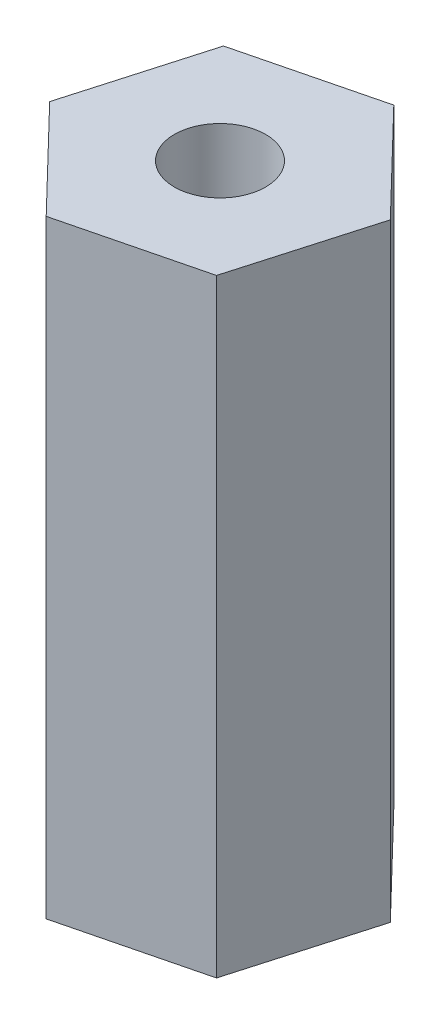
ISO-10303-21;
HEADER;
FILE_DESCRIPTION(('STEP AP214'),'2;1');
FILE_NAME('part.step','',(''),(''),'','','');
FILE_SCHEMA(('AUTOMOTIVE_DESIGN { 1 0 10303 214 1 1 1 1 }'));
ENDSEC;
DATA;
#1=APPLICATION_CONTEXT('core data for automotive mechanical design processes');
#2=APPLICATION_PROTOCOL_DEFINITION('international standard','automotive_design',2000,#1);
#3=PRODUCT_CONTEXT('',#1,'mechanical');
#4=PRODUCT('Part','Part','',(#3));
#5=PRODUCT_RELATED_PRODUCT_CATEGORY('part','',(#4));
#6=PRODUCT_DEFINITION_FORMATION('','',#4);
#7=PRODUCT_DEFINITION_CONTEXT('part definition',#1,'design');
#8=PRODUCT_DEFINITION('design','',#6,#7);
#9=PRODUCT_DEFINITION_SHAPE('','',#8);
#10=(LENGTH_UNIT() NAMED_UNIT(*) SI_UNIT(.MILLI.,.METRE.));
#11=(NAMED_UNIT(*) PLANE_ANGLE_UNIT() SI_UNIT($,.RADIAN.));
#12=(NAMED_UNIT(*) SI_UNIT($,.STERADIAN.) SOLID_ANGLE_UNIT());
#13=UNCERTAINTY_MEASURE_WITH_UNIT(LENGTH_MEASURE(1.E-05),#10,'distance_accuracy_value','');
#14=(GEOMETRIC_REPRESENTATION_CONTEXT(3) GLOBAL_UNCERTAINTY_ASSIGNED_CONTEXT((#13)) GLOBAL_UNIT_ASSIGNED_CONTEXT((#10,
#11,#12)) REPRESENTATION_CONTEXT('',''));
#15=CARTESIAN_POINT('',(0.,0.,0.));
#16=DIRECTION('',(0.,0.,1.));
#17=DIRECTION('',(1.,0.,0.));
#18=AXIS2_PLACEMENT_3D('',#15,#16,#17);
#19=CARTESIAN_POINT('',(-1.27350852462126,20.,4.43976456256977));
#20=DIRECTION('',(-0.241835763884429,0.,-0.970317197264088));
#21=DIRECTION('',(-0.970317197264088,0.,0.241835763884429));
#22=AXIS2_PLACEMENT_3D('',#19,#20,#21);
#23=PLANE('',#22);
#24=DIRECTION('',(0.970317197264088,0.,-0.241835763884429));
#25=VECTOR('',#24,1.);
#26=CARTESIAN_POINT('',(-1.27350852462126,0.,4.43976456256977));
#27=LINE('',#26,#25);
#28=CARTESIAN_POINT('',(-1.27350852462126,0.,4.43976456256977));
#29=VERTEX_POINT('',#28);
#30=CARTESIAN_POINT('',(3.20819463569669,0.,3.32277301554294));
#31=VERTEX_POINT('',#30);
#32=EDGE_CURVE('E117',#29,#31,#27,.T.);
#33=ORIENTED_EDGE('',*,*,#32,.T.);
#34=DIRECTION('',(0.,-1.,0.));
#35=VECTOR('',#34,1.);
#36=CARTESIAN_POINT('',(3.20819463569669,20.,3.32277301554294));
#37=LINE('',#36,#35);
#38=CARTESIAN_POINT('',(3.20819463569669,20.,3.32277301554294));
#39=VERTEX_POINT('',#38);
#40=EDGE_CURVE('E11',#39,#31,#37,.T.);
#41=ORIENTED_EDGE('',*,*,#40,.F.);
#42=DIRECTION('',(0.970317197264088,0.,-0.241835763884429));
#43=VECTOR('',#42,1.);
#44=CARTESIAN_POINT('',(-1.27350852462126,20.,4.43976456256977));
#45=LINE('',#44,#43);
#46=CARTESIAN_POINT('',(-1.27350852462126,20.,4.43976456256977));
#47=VERTEX_POINT('',#46);
#48=EDGE_CURVE('E128',#47,#39,#45,.T.);
#49=ORIENTED_EDGE('',*,*,#48,.F.);
#50=DIRECTION('',(0.,-1.,0.));
#51=VECTOR('',#50,1.);
#52=CARTESIAN_POINT('',(-1.27350852462126,20.,4.43976456256977));
#53=LINE('',#52,#51);
#54=EDGE_CURVE('E113',#47,#29,#53,.T.);
#55=ORIENTED_EDGE('',*,*,#54,.T.);
#56=EDGE_LOOP('',(#33,#41,#49,#55));
#57=FACE_BOUND('',#56,.T.);
#58=ADVANCED_FACE('F33',(#57),#23,.F.);
#59=CARTESIAN_POINT('',(3.20819463569669,20.,3.32277301554294));
#60=DIRECTION('',(-0.961237224501831,0.,-0.275722683564513));
#61=DIRECTION('',(-0.275722683564513,0.,0.961237224501831));
#62=AXIS2_PLACEMENT_3D('',#59,#60,#61);
#63=PLANE('',#62);
#64=DIRECTION('',(0.275722683564513,0.,-0.961237224501831));
#65=VECTOR('',#64,1.);
#66=CARTESIAN_POINT('',(3.20819463569669,0.,3.32277301554294));
#67=LINE('',#66,#65);
#68=CARTESIAN_POINT('',(4.48170316031795,0.,-1.11699154702683));
#69=VERTEX_POINT('',#68);
#70=EDGE_CURVE('E120',#31,#69,#67,.T.);
#71=ORIENTED_EDGE('',*,*,#70,.T.);
#72=DIRECTION('',(0.,-1.,0.));
#73=VECTOR('',#72,1.);
#74=CARTESIAN_POINT('',(4.48170316031795,20.,-1.11699154702683));
#75=LINE('',#74,#73);
#76=CARTESIAN_POINT('',(4.48170316031795,20.,-1.11699154702683));
#77=VERTEX_POINT('',#76);
#78=EDGE_CURVE('E41',#77,#69,#75,.T.);
#79=ORIENTED_EDGE('',*,*,#78,.F.);
#80=DIRECTION('',(0.275722683564513,0.,-0.961237224501831));
#81=VECTOR('',#80,1.);
#82=CARTESIAN_POINT('',(3.20819463569669,20.,3.32277301554294));
#83=LINE('',#82,#81);
#84=EDGE_CURVE('E86',#39,#77,#83,.T.);
#85=ORIENTED_EDGE('',*,*,#84,.F.);
#86=ORIENTED_EDGE('',*,*,#40,.T.);
#87=EDGE_LOOP('',(#71,#79,#85,#86));
#88=FACE_BOUND('',#87,.T.);
#89=ADVANCED_FACE('F153',(#88),#63,.F.);
#90=CARTESIAN_POINT('',(4.48170316031795,20.,-1.11699154702683));
#91=DIRECTION('',(-0.719401460617402,0.,0.694594513699574));
#92=DIRECTION('',(0.694594513699574,0.,0.719401460617402));
#93=AXIS2_PLACEMENT_3D('',#90,#91,#92);
#94=PLANE('',#93);
#95=DIRECTION('',(-0.694594513699574,0.,-0.719401460617402));
#96=VECTOR('',#95,1.);
#97=CARTESIAN_POINT('',(4.48170316031795,0.,-1.11699154702683));
#98=LINE('',#97,#96);
#99=CARTESIAN_POINT('',(1.27350852462126,0.,-4.43976456256977));
#100=VERTEX_POINT('',#99);
#101=EDGE_CURVE('E123',#69,#100,#98,.T.);
#102=ORIENTED_EDGE('',*,*,#101,.T.);
#103=DIRECTION('',(0.,-1.,0.));
#104=VECTOR('',#103,1.);
#105=CARTESIAN_POINT('',(1.27350852462126,20.,-4.43976456256977));
#106=LINE('',#105,#104);
#107=CARTESIAN_POINT('',(1.27350852462126,20.,-4.43976456256977));
#108=VERTEX_POINT('',#107);
#109=EDGE_CURVE('E108',#108,#100,#106,.T.);
#110=ORIENTED_EDGE('',*,*,#109,.F.);
#111=DIRECTION('',(-0.694594513699574,0.,-0.719401460617402));
#112=VECTOR('',#111,1.);
#113=CARTESIAN_POINT('',(4.48170316031795,20.,-1.11699154702683));
#114=LINE('',#113,#112);
#115=EDGE_CURVE('E99',#77,#108,#114,.T.);
#116=ORIENTED_EDGE('',*,*,#115,.F.);
#117=ORIENTED_EDGE('',*,*,#78,.T.);
#118=EDGE_LOOP('',(#102,#110,#116,#117));
#119=FACE_BOUND('',#118,.T.);
#120=ADVANCED_FACE('F134',(#119),#94,.F.);
#121=CARTESIAN_POINT('',(1.27350852462126,20.,-4.43976456256977));
#122=DIRECTION('',(0.241835763884429,0.,0.970317197264088));
#123=DIRECTION('',(0.970317197264088,0.,-0.241835763884429));
#124=AXIS2_PLACEMENT_3D('',#121,#122,#123);
#125=PLANE('',#124);
#126=DIRECTION('',(-0.970317197264088,0.,0.241835763884429));
#127=VECTOR('',#126,1.);
#128=CARTESIAN_POINT('',(1.27350852462126,0.,-4.43976456256977));
#129=LINE('',#128,#127);
#130=CARTESIAN_POINT('',(-3.20819463569669,0.,-3.32277301554294));
#131=VERTEX_POINT('',#130);
#132=EDGE_CURVE('E107',#100,#131,#129,.T.);
#133=ORIENTED_EDGE('',*,*,#132,.T.);
#134=DIRECTION('',(0.,-1.,0.));
#135=VECTOR('',#134,1.);
#136=CARTESIAN_POINT('',(-3.20819463569669,20.,-3.32277301554294));
#137=LINE('',#136,#135);
#138=CARTESIAN_POINT('',(-3.20819463569669,20.,-3.32277301554294));
#139=VERTEX_POINT('',#138);
#140=EDGE_CURVE('E104',#139,#131,#137,.T.);
#141=ORIENTED_EDGE('',*,*,#140,.F.);
#142=DIRECTION('',(-0.970317197264088,0.,0.241835763884429));
#143=VECTOR('',#142,1.);
#144=CARTESIAN_POINT('',(1.27350852462126,20.,-4.43976456256977));
#145=LINE('',#144,#143);
#146=EDGE_CURVE('E93',#108,#139,#145,.T.);
#147=ORIENTED_EDGE('',*,*,#146,.F.);
#148=ORIENTED_EDGE('',*,*,#109,.T.);
#149=EDGE_LOOP('',(#133,#141,#147,#148));
#150=FACE_BOUND('',#149,.T.);
#151=ADVANCED_FACE('F105',(#150),#125,.F.);
#152=CARTESIAN_POINT('',(-3.20819463569669,20.,-3.32277301554294));
#153=DIRECTION('',(0.961237224501831,0.,0.275722683564513));
#154=DIRECTION('',(0.275722683564513,0.,-0.961237224501831));
#155=AXIS2_PLACEMENT_3D('',#152,#153,#154);
#156=PLANE('',#155);
#157=DIRECTION('',(-0.275722683564513,0.,0.961237224501831));
#158=VECTOR('',#157,1.);
#159=CARTESIAN_POINT('',(-3.20819463569669,0.,-3.32277301554294));
#160=LINE('',#159,#158);
#161=CARTESIAN_POINT('',(-4.48170316031795,0.,1.11699154702683));
#162=VERTEX_POINT('',#161);
#163=EDGE_CURVE('E72',#131,#162,#160,.T.);
#164=ORIENTED_EDGE('',*,*,#163,.T.);
#165=DIRECTION('',(0.,-1.,0.));
#166=VECTOR('',#165,1.);
#167=CARTESIAN_POINT('',(-4.48170316031795,20.,1.11699154702683));
#168=LINE('',#167,#166);
#169=CARTESIAN_POINT('',(-4.48170316031795,20.,1.11699154702683));
#170=VERTEX_POINT('',#169);
#171=EDGE_CURVE('E109',#170,#162,#168,.T.);
#172=ORIENTED_EDGE('',*,*,#171,.F.);
#173=DIRECTION('',(-0.275722683564513,0.,0.961237224501831));
#174=VECTOR('',#173,1.);
#175=CARTESIAN_POINT('',(-3.20819463569669,20.,-3.32277301554294));
#176=LINE('',#175,#174);
#177=EDGE_CURVE('E97',#139,#170,#176,.T.);
#178=ORIENTED_EDGE('',*,*,#177,.F.);
#179=ORIENTED_EDGE('',*,*,#140,.T.);
#180=EDGE_LOOP('',(#164,#172,#178,#179));
#181=FACE_BOUND('',#180,.T.);
#182=ADVANCED_FACE('F111',(#181),#156,.F.);
#183=CARTESIAN_POINT('',(-4.48170316031795,20.,1.11699154702683));
#184=DIRECTION('',(0.719401460617402,0.,-0.694594513699574));
#185=DIRECTION('',(-0.694594513699574,0.,-0.719401460617402));
#186=AXIS2_PLACEMENT_3D('',#183,#184,#185);
#187=PLANE('',#186);
#188=DIRECTION('',(0.694594513699574,0.,0.719401460617402));
#189=VECTOR('',#188,1.);
#190=CARTESIAN_POINT('',(-4.48170316031795,0.,1.11699154702683));
#191=LINE('',#190,#189);
#192=EDGE_CURVE('E78',#162,#29,#191,.T.);
#193=ORIENTED_EDGE('',*,*,#192,.T.);
#194=ORIENTED_EDGE('',*,*,#54,.F.);
#195=DIRECTION('',(0.694594513699574,0.,0.719401460617402));
#196=VECTOR('',#195,1.);
#197=CARTESIAN_POINT('',(-4.48170316031795,20.,1.11699154702683));
#198=LINE('',#197,#196);
#199=EDGE_CURVE('E49',#170,#47,#198,.T.);
#200=ORIENTED_EDGE('',*,*,#199,.F.);
#201=ORIENTED_EDGE('',*,*,#171,.T.);
#202=EDGE_LOOP('',(#193,#194,#200,#201));
#203=FACE_BOUND('',#202,.T.);
#204=ADVANCED_FACE('F141',(#203),#187,.F.);
#205=CARTESIAN_POINT('',(0.,20.,0.));
#206=DIRECTION('',(0.,1.,0.));
#207=DIRECTION('',(0.,0.,1.));
#208=AXIS2_PLACEMENT_3D('',#205,#206,#207);
#209=PLANE('',#208);
#210=CARTESIAN_POINT('',(0.,20.,0.));
#211=DIRECTION('',(0.,1.,0.));
#212=DIRECTION('',(0.,0.,1.));
#213=AXIS2_PLACEMENT_3D('',#210,#211,#212);
#214=CIRCLE('',#213,1.5);
#215=CARTESIAN_POINT('',(0.,20.,1.5));
#216=VERTEX_POINT('',#215);
#217=EDGE_CURVE('E121',#216,#216,#214,.T.);
#218=ORIENTED_EDGE('',*,*,#217,.F.);
#219=EDGE_LOOP('',(#218));
#220=FACE_BOUND('',#219,.T.);
#221=ORIENTED_EDGE('',*,*,#48,.T.);
#222=ORIENTED_EDGE('',*,*,#84,.T.);
#223=ORIENTED_EDGE('',*,*,#115,.T.);
#224=ORIENTED_EDGE('',*,*,#146,.T.);
#225=ORIENTED_EDGE('',*,*,#177,.T.);
#226=ORIENTED_EDGE('',*,*,#199,.T.);
#227=EDGE_LOOP('',(#221,#222,#223,#224,#225,#226));
#228=FACE_BOUND('',#227,.T.);
#229=ADVANCED_FACE('F95',(#220,#228),#209,.T.);
#230=CARTESIAN_POINT('',(0.,0.,0.));
#231=DIRECTION('',(0.,1.,0.));
#232=DIRECTION('',(0.,0.,1.));
#233=AXIS2_PLACEMENT_3D('',#230,#231,#232);
#234=PLANE('',#233);
#235=CARTESIAN_POINT('',(0.,0.,0.));
#236=DIRECTION('',(0.,-1.,0.));
#237=DIRECTION('',(0.,0.,-1.));
#238=AXIS2_PLACEMENT_3D('',#235,#236,#237);
#239=CIRCLE('',#238,1.5);
#240=CARTESIAN_POINT('',(0.,0.,-1.5));
#241=VERTEX_POINT('',#240);
#242=EDGE_CURVE('E208',#241,#241,#239,.T.);
#243=ORIENTED_EDGE('',*,*,#242,.F.);
#244=EDGE_LOOP('',(#243));
#245=FACE_BOUND('',#244,.T.);
#246=ORIENTED_EDGE('',*,*,#32,.F.);
#247=ORIENTED_EDGE('',*,*,#192,.F.);
#248=ORIENTED_EDGE('',*,*,#163,.F.);
#249=ORIENTED_EDGE('',*,*,#132,.F.);
#250=ORIENTED_EDGE('',*,*,#101,.F.);
#251=ORIENTED_EDGE('',*,*,#70,.F.);
#252=EDGE_LOOP('',(#246,#247,#248,#249,#250,#251));
#253=FACE_BOUND('',#252,.T.);
#254=ADVANCED_FACE('F137',(#245,#253),#234,.F.);
#255=CARTESIAN_POINT('',(0.,30.,0.));
#256=DIRECTION('',(0.,-1.,0.));
#257=DIRECTION('',(0.,0.,-1.));
#258=AXIS2_PLACEMENT_3D('',#255,#256,#257);
#259=CYLINDRICAL_SURFACE('',#258,1.5);
#260=ORIENTED_EDGE('',*,*,#217,.T.);
#261=EDGE_LOOP('',(#260));
#262=FACE_BOUND('',#261,.T.);
#263=ORIENTED_EDGE('',*,*,#242,.T.);
#264=EDGE_LOOP('',(#263));
#265=FACE_BOUND('',#264,.T.);
#266=ADVANCED_FACE('F190',(#262,#265),#259,.F.);
#267=CLOSED_SHELL('',(#58,#89,#120,#151,#182,#204,#229,#254,#266));
#268=MANIFOLD_SOLID_BREP('B2',#267);
#269=ADVANCED_BREP_SHAPE_REPRESENTATION('',(#18,#268),#14);
#270=SHAPE_DEFINITION_REPRESENTATION(#9,#269);
ENDSEC;
END-ISO-10303-21;
